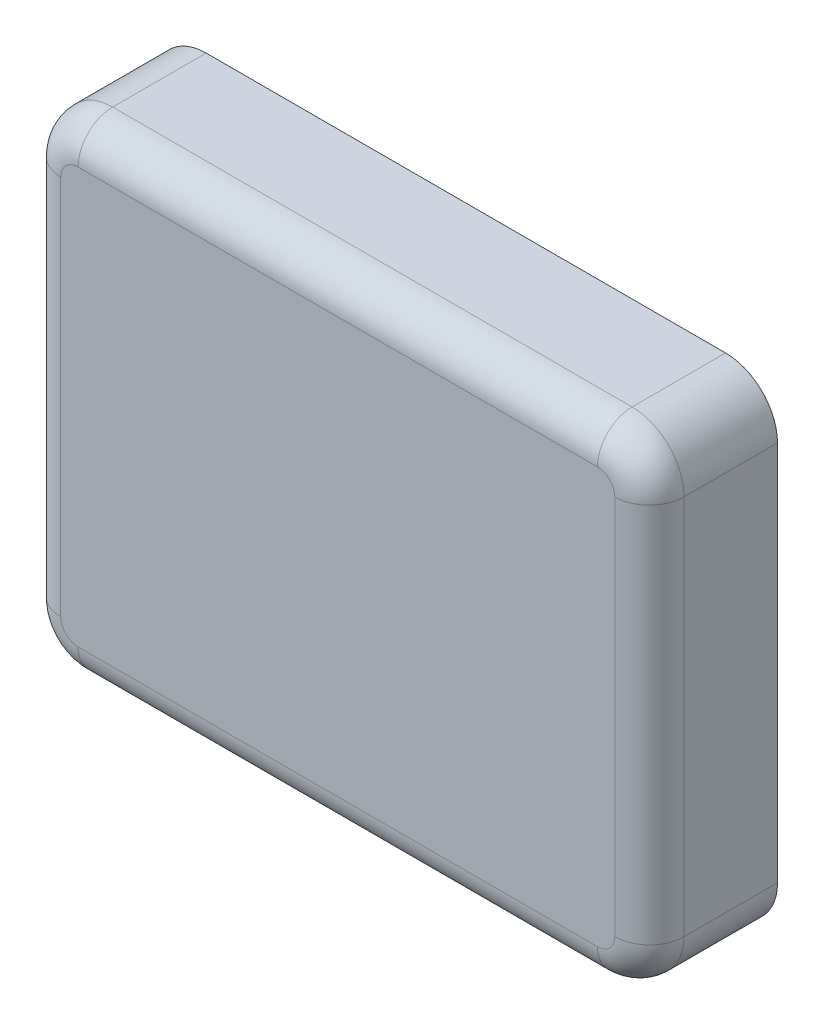
ISO-10303-21;
HEADER;
FILE_DESCRIPTION(('STEP AP214'),'2;1');
FILE_NAME('part.step','',(''),(''),'','','');
FILE_SCHEMA(('AUTOMOTIVE_DESIGN { 1 0 10303 214 1 1 1 1 }'));
ENDSEC;
DATA;
#1=APPLICATION_CONTEXT('core data for automotive mechanical design processes');
#2=APPLICATION_PROTOCOL_DEFINITION('international standard','automotive_design',2000,#1);
#3=PRODUCT_CONTEXT('',#1,'mechanical');
#4=PRODUCT('Part','Part','',(#3));
#5=PRODUCT_RELATED_PRODUCT_CATEGORY('part','',(#4));
#6=PRODUCT_DEFINITION_FORMATION('','',#4);
#7=PRODUCT_DEFINITION_CONTEXT('part definition',#1,'design');
#8=PRODUCT_DEFINITION('design','',#6,#7);
#9=PRODUCT_DEFINITION_SHAPE('','',#8);
#10=(LENGTH_UNIT() NAMED_UNIT(*) SI_UNIT(.MILLI.,.METRE.));
#11=(NAMED_UNIT(*) PLANE_ANGLE_UNIT() SI_UNIT($,.RADIAN.));
#12=(NAMED_UNIT(*) SI_UNIT($,.STERADIAN.) SOLID_ANGLE_UNIT());
#13=UNCERTAINTY_MEASURE_WITH_UNIT(LENGTH_MEASURE(1.E-05),#10,'distance_accuracy_value','');
#14=(GEOMETRIC_REPRESENTATION_CONTEXT(3) GLOBAL_UNCERTAINTY_ASSIGNED_CONTEXT((#13)) GLOBAL_UNIT_ASSIGNED_CONTEXT((#10,
#11,#12)) REPRESENTATION_CONTEXT('',''));
#15=CARTESIAN_POINT('',(0.,0.,0.));
#16=DIRECTION('',(0.,0.,1.));
#17=DIRECTION('',(1.,0.,0.));
#18=AXIS2_PLACEMENT_3D('',#15,#16,#17);
#19=CARTESIAN_POINT('',(-0.9,-0.7,0.33));
#20=DIRECTION('',(1.,0.,0.));
#21=DIRECTION('',(0.,0.,-1.));
#22=AXIS2_PLACEMENT_3D('',#19,#20,#21);
#23=PLANE('',#22);
#24=DIRECTION('',(0.,0.,1.));
#25=VECTOR('',#24,1.);
#26=CARTESIAN_POINT('',(-0.9,-0.55,0.33));
#27=LINE('',#26,#25);
#28=CARTESIAN_POINT('',(-0.9,-0.55,0.33));
#29=VERTEX_POINT('',#28);
#30=CARTESIAN_POINT('',(-0.9,-0.55,0.6));
#31=VERTEX_POINT('',#30);
#32=EDGE_CURVE('E10',#29,#31,#27,.T.);
#33=ORIENTED_EDGE('',*,*,#32,.T.);
#34=DIRECTION('',(0.,-1.,0.));
#35=VECTOR('',#34,1.);
#36=CARTESIAN_POINT('',(-0.9,0.55,0.6));
#37=LINE('',#36,#35);
#38=CARTESIAN_POINT('',(-0.9,0.55,0.6));
#39=VERTEX_POINT('',#38);
#40=EDGE_CURVE('E227',#39,#31,#37,.T.);
#41=ORIENTED_EDGE('',*,*,#40,.F.);
#42=DIRECTION('',(0.,0.,1.));
#43=VECTOR('',#42,1.);
#44=CARTESIAN_POINT('',(-0.9,0.55,0.33));
#45=LINE('',#44,#43);
#46=CARTESIAN_POINT('',(-0.9,0.55,0.33));
#47=VERTEX_POINT('',#46);
#48=EDGE_CURVE('E215',#47,#39,#45,.T.);
#49=ORIENTED_EDGE('',*,*,#48,.F.);
#50=DIRECTION('',(0.,1.,0.));
#51=VECTOR('',#50,1.);
#52=CARTESIAN_POINT('',(-0.9,-0.7,0.33));
#53=LINE('',#52,#51);
#54=EDGE_CURVE('E208',#29,#47,#53,.T.);
#55=ORIENTED_EDGE('',*,*,#54,.F.);
#56=EDGE_LOOP('',(#33,#41,#49,#55));
#57=FACE_BOUND('',#56,.T.);
#58=ADVANCED_FACE('F16',(#57),#23,.F.);
#59=CARTESIAN_POINT('',(-0.75,-0.55,0.33));
#60=DIRECTION('',(0.,0.,1.));
#61=DIRECTION('',(1.,0.,0.));
#62=AXIS2_PLACEMENT_3D('',#59,#60,#61);
#63=CYLINDRICAL_SURFACE('',#62,0.15);
#64=ORIENTED_EDGE('',*,*,#32,.F.);
#65=CARTESIAN_POINT('',(-0.75,-0.55,0.33));
#66=DIRECTION('',(0.,0.,1.));
#67=DIRECTION('',(1.,0.,0.));
#68=AXIS2_PLACEMENT_3D('',#65,#66,#67);
#69=CIRCLE('',#68,0.15);
#70=CARTESIAN_POINT('',(-0.75,-0.7,0.33));
#71=VERTEX_POINT('',#70);
#72=EDGE_CURVE('E26',#29,#71,#69,.T.);
#73=ORIENTED_EDGE('',*,*,#72,.T.);
#74=DIRECTION('',(0.,0.,1.));
#75=VECTOR('',#74,1.);
#76=CARTESIAN_POINT('',(-0.75,-0.7,0.33));
#77=LINE('',#76,#75);
#78=CARTESIAN_POINT('',(-0.75,-0.7,0.6));
#79=VERTEX_POINT('',#78);
#80=EDGE_CURVE('E232',#71,#79,#77,.T.);
#81=ORIENTED_EDGE('',*,*,#80,.T.);
#82=CARTESIAN_POINT('',(-0.75,-0.55,0.6));
#83=DIRECTION('',(0.,0.,1.));
#84=DIRECTION('',(1.,0.,0.));
#85=AXIS2_PLACEMENT_3D('',#82,#83,#84);
#86=CIRCLE('',#85,0.15);
#87=EDGE_CURVE('E35',#31,#79,#86,.T.);
#88=ORIENTED_EDGE('',*,*,#87,.F.);
#89=EDGE_LOOP('',(#64,#73,#81,#88));
#90=FACE_BOUND('',#89,.T.);
#91=ADVANCED_FACE('F251',(#90),#63,.T.);
#92=CARTESIAN_POINT('',(-0.8,0.55,0.6));
#93=DIRECTION('',(0.,-1.,0.));
#94=DIRECTION('',(0.,0.,-1.));
#95=AXIS2_PLACEMENT_3D('',#92,#93,#94);
#96=CYLINDRICAL_SURFACE('',#95,0.1);
#97=CARTESIAN_POINT('',(-0.8,0.55,0.6));
#98=DIRECTION('',(0.,-1.,0.));
#99=DIRECTION('',(-1.,0.,0.));
#100=AXIS2_PLACEMENT_3D('',#97,#98,#99);
#101=CIRCLE('',#100,0.1);
#102=CARTESIAN_POINT('',(-0.8,0.55,0.7));
#103=VERTEX_POINT('',#102);
#104=EDGE_CURVE('E234',#103,#39,#101,.T.);
#105=ORIENTED_EDGE('',*,*,#104,.T.);
#106=ORIENTED_EDGE('',*,*,#40,.T.);
#107=CARTESIAN_POINT('',(-0.8,-0.55,0.6));
#108=DIRECTION('',(0.,-1.,0.));
#109=DIRECTION('',(0.,0.,-1.));
#110=AXIS2_PLACEMENT_3D('',#107,#108,#109);
#111=CIRCLE('',#110,0.1);
#112=CARTESIAN_POINT('',(-0.8,-0.55,0.7));
#113=VERTEX_POINT('',#112);
#114=EDGE_CURVE('E203',#113,#31,#111,.T.);
#115=ORIENTED_EDGE('',*,*,#114,.F.);
#116=DIRECTION('',(0.,-1.,0.));
#117=VECTOR('',#116,1.);
#118=CARTESIAN_POINT('',(-0.8,0.55,0.7));
#119=LINE('',#118,#117);
#120=EDGE_CURVE('E185',#103,#113,#119,.T.);
#121=ORIENTED_EDGE('',*,*,#120,.F.);
#122=EDGE_LOOP('',(#105,#106,#115,#121));
#123=FACE_BOUND('',#122,.T.);
#124=ADVANCED_FACE('F237',(#123),#96,.T.);
#125=CARTESIAN_POINT('',(-0.9,-0.7,0.33));
#126=DIRECTION('',(0.,0.,1.));
#127=DIRECTION('',(1.,0.,0.));
#128=AXIS2_PLACEMENT_3D('',#125,#126,#127);
#129=PLANE('',#128);
#130=ORIENTED_EDGE('',*,*,#54,.T.);
#131=CARTESIAN_POINT('',(-0.75,0.55,0.33));
#132=DIRECTION('',(0.,0.,-1.));
#133=DIRECTION('',(0.,-1.,0.));
#134=AXIS2_PLACEMENT_3D('',#131,#132,#133);
#135=CIRCLE('',#134,0.15);
#136=CARTESIAN_POINT('',(-0.75,0.7,0.33));
#137=VERTEX_POINT('',#136);
#138=EDGE_CURVE('E205',#47,#137,#135,.T.);
#139=ORIENTED_EDGE('',*,*,#138,.T.);
#140=DIRECTION('',(1.,0.,0.));
#141=VECTOR('',#140,1.);
#142=CARTESIAN_POINT('',(-0.9,0.7,0.33));
#143=LINE('',#142,#141);
#144=CARTESIAN_POINT('',(0.75,0.7,0.33));
#145=VERTEX_POINT('',#144);
#146=EDGE_CURVE('E209',#137,#145,#143,.T.);
#147=ORIENTED_EDGE('',*,*,#146,.T.);
#148=CARTESIAN_POINT('',(0.75,0.55,0.33));
#149=DIRECTION('',(0.,0.,1.));
#150=DIRECTION('',(1.,0.,0.));
#151=AXIS2_PLACEMENT_3D('',#148,#149,#150);
#152=CIRCLE('',#151,0.15);
#153=CARTESIAN_POINT('',(0.9,0.55,0.33));
#154=VERTEX_POINT('',#153);
#155=EDGE_CURVE('E158',#154,#145,#152,.T.);
#156=ORIENTED_EDGE('',*,*,#155,.F.);
#157=DIRECTION('',(0.,1.,0.));
#158=VECTOR('',#157,1.);
#159=CARTESIAN_POINT('',(0.9,-0.7,0.33));
#160=LINE('',#159,#158);
#161=CARTESIAN_POINT('',(0.9,-0.55,0.33));
#162=VERTEX_POINT('',#161);
#163=EDGE_CURVE('E128',#162,#154,#160,.T.);
#164=ORIENTED_EDGE('',*,*,#163,.F.);
#165=CARTESIAN_POINT('',(0.75,-0.55,0.33));
#166=DIRECTION('',(0.,0.,-1.));
#167=DIRECTION('',(0.,-1.,0.));
#168=AXIS2_PLACEMENT_3D('',#165,#166,#167);
#169=CIRCLE('',#168,0.15);
#170=CARTESIAN_POINT('',(0.75,-0.7,0.33));
#171=VERTEX_POINT('',#170);
#172=EDGE_CURVE('E212',#162,#171,#169,.T.);
#173=ORIENTED_EDGE('',*,*,#172,.T.);
#174=DIRECTION('',(1.,0.,0.));
#175=VECTOR('',#174,1.);
#176=CARTESIAN_POINT('',(-0.9,-0.7,0.33));
#177=LINE('',#176,#175);
#178=EDGE_CURVE('E195',#71,#171,#177,.T.);
#179=ORIENTED_EDGE('',*,*,#178,.F.);
#180=ORIENTED_EDGE('',*,*,#72,.F.);
#181=EDGE_LOOP('',(#130,#139,#147,#156,#164,#173,#179,#180));
#182=FACE_BOUND('',#181,.T.);
#183=ADVANCED_FACE('F250',(#182),#129,.F.);
#184=CARTESIAN_POINT('',(-0.75,0.55,0.33));
#185=DIRECTION('',(0.,0.,1.));
#186=DIRECTION('',(1.,0.,0.));
#187=AXIS2_PLACEMENT_3D('',#184,#185,#186);
#188=CYLINDRICAL_SURFACE('',#187,0.15);
#189=ORIENTED_EDGE('',*,*,#48,.T.);
#190=CARTESIAN_POINT('',(-0.75,0.55,0.6));
#191=DIRECTION('',(0.,0.,1.));
#192=DIRECTION('',(1.,0.,0.));
#193=AXIS2_PLACEMENT_3D('',#190,#191,#192);
#194=CIRCLE('',#193,0.15);
#195=CARTESIAN_POINT('',(-0.75,0.7,0.6));
#196=VERTEX_POINT('',#195);
#197=EDGE_CURVE('E183',#196,#39,#194,.T.);
#198=ORIENTED_EDGE('',*,*,#197,.F.);
#199=DIRECTION('',(0.,0.,1.));
#200=VECTOR('',#199,1.);
#201=CARTESIAN_POINT('',(-0.75,0.7,0.33));
#202=LINE('',#201,#200);
#203=EDGE_CURVE('E162',#137,#196,#202,.T.);
#204=ORIENTED_EDGE('',*,*,#203,.F.);
#205=ORIENTED_EDGE('',*,*,#138,.F.);
#206=EDGE_LOOP('',(#189,#198,#204,#205));
#207=FACE_BOUND('',#206,.T.);
#208=ADVANCED_FACE('F265',(#207),#188,.T.);
#209=CARTESIAN_POINT('',(-0.8,-0.55,0.7));
#210=CARTESIAN_POINT('',(-0.8,-0.6,0.7));
#211=CARTESIAN_POINT('',(-0.75,-0.6,0.7));
#212=CARTESIAN_POINT('',(-0.7,-0.6,0.7));
#213=CARTESIAN_POINT('',(-0.7,-0.55,0.7));
#214=CARTESIAN_POINT('',(-0.7,-0.5,0.7));
#215=CARTESIAN_POINT('',(-0.75,-0.5,0.7));
#216=CARTESIAN_POINT('',(-0.8,-0.5,0.7));
#217=CARTESIAN_POINT('',(-0.8,-0.55,0.7));
#218=CARTESIAN_POINT('',(-0.82617993878,-0.55,0.7));
#219=CARTESIAN_POINT('',(-0.82617993878,-0.62617993878,0.7));
#220=CARTESIAN_POINT('',(-0.75,-0.62617993878,0.7));
#221=CARTESIAN_POINT('',(-0.67382006122,-0.62617993878,0.7));
#222=CARTESIAN_POINT('',(-0.67382006122,-0.55,0.7));
#223=CARTESIAN_POINT('',(-0.67382006122,-0.47382006122,0.7));
#224=CARTESIAN_POINT('',(-0.75,-0.47382006122,0.7));
#225=CARTESIAN_POINT('',(-0.82617993878,-0.47382006122,0.7));
#226=CARTESIAN_POINT('',(-0.82617993878,-0.55,0.7));
#227=CARTESIAN_POINT('',(-0.852357650071,-0.55,0.691777231398));
#228=CARTESIAN_POINT('',(-0.852357650071,-0.652357650071,0.691777231398));
#229=CARTESIAN_POINT('',(-0.75,-0.652357650071,0.691777231398));
#230=CARTESIAN_POINT('',(-0.647642349929,-0.652357650071,0.691777231398));
#231=CARTESIAN_POINT('',(-0.647642349929,-0.55,0.691777231398));
#232=CARTESIAN_POINT('',(-0.647642349929,-0.447642349929,0.691777231398));
#233=CARTESIAN_POINT('',(-0.75,-0.447642349929,0.691777231398));
#234=CARTESIAN_POINT('',(-0.852357650071,-0.447642349929,0.691777231398));
#235=CARTESIAN_POINT('',(-0.852357650071,-0.55,0.691777231398));
#236=CARTESIAN_POINT('',(-0.875319014964,-0.55,0.675319014964));
#237=CARTESIAN_POINT('',(-0.875319014964,-0.675319014964,0.675319014964));
#238=CARTESIAN_POINT('',(-0.75,-0.675319014964,0.675319014964));
#239=CARTESIAN_POINT('',(-0.624680985036,-0.675319014964,0.675319014964));
#240=CARTESIAN_POINT('',(-0.624680985036,-0.55,0.675319014964));
#241=CARTESIAN_POINT('',(-0.624680985036,-0.424680985036,0.675319014964));
#242=CARTESIAN_POINT('',(-0.75,-0.424680985036,0.675319014964));
#243=CARTESIAN_POINT('',(-0.875319014964,-0.424680985036,0.675319014964));
#244=CARTESIAN_POINT('',(-0.875319014964,-0.55,0.675319014964));
#245=CARTESIAN_POINT('',(-0.891777231398,-0.55,0.652357650071));
#246=CARTESIAN_POINT('',(-0.891777231398,-0.691777231398,0.652357650071));
#247=CARTESIAN_POINT('',(-0.75,-0.691777231398,0.652357650071));
#248=CARTESIAN_POINT('',(-0.608222768602,-0.691777231398,0.652357650071));
#249=CARTESIAN_POINT('',(-0.608222768602,-0.55,0.652357650071));
#250=CARTESIAN_POINT('',(-0.608222768602,-0.408222768602,0.652357650071));
#251=CARTESIAN_POINT('',(-0.75,-0.408222768602,0.652357650071));
#252=CARTESIAN_POINT('',(-0.891777231398,-0.408222768602,0.652357650071));
#253=CARTESIAN_POINT('',(-0.891777231398,-0.55,0.652357650071));
#254=CARTESIAN_POINT('',(-0.9,-0.55,0.62617993878));
#255=CARTESIAN_POINT('',(-0.9,-0.7,0.62617993878));
#256=CARTESIAN_POINT('',(-0.75,-0.7,0.62617993878));
#257=CARTESIAN_POINT('',(-0.6,-0.7,0.62617993878));
#258=CARTESIAN_POINT('',(-0.6,-0.55,0.62617993878));
#259=CARTESIAN_POINT('',(-0.6,-0.4,0.62617993878));
#260=CARTESIAN_POINT('',(-0.75,-0.4,0.62617993878));
#261=CARTESIAN_POINT('',(-0.9,-0.4,0.62617993878));
#262=CARTESIAN_POINT('',(-0.9,-0.55,0.62617993878));
#263=CARTESIAN_POINT('',(-0.9,-0.55,0.6));
#264=CARTESIAN_POINT('',(-0.9,-0.7,0.6));
#265=CARTESIAN_POINT('',(-0.75,-0.7,0.6));
#266=CARTESIAN_POINT('',(-0.6,-0.7,0.6));
#267=CARTESIAN_POINT('',(-0.6,-0.55,0.6));
#268=CARTESIAN_POINT('',(-0.6,-0.4,0.6));
#269=CARTESIAN_POINT('',(-0.75,-0.4,0.6));
#270=CARTESIAN_POINT('',(-0.9,-0.4,0.6));
#271=CARTESIAN_POINT('',(-0.9,-0.55,0.6));
#272=(BOUNDED_SURFACE() B_SPLINE_SURFACE(6,2,((#209,#210,#211,#212,#213,#214,#215,#216,#217),
(#218,#219,#220,#221,#222,#223,#224,#225,#226),(#227,#228,#229,#230,#231,#232,#233,#234,#235),
(#236,#237,#238,#239,#240,#241,#242,#243,#244),(#245,#246,#247,#248,#249,#250,#251,#252,#253),
(#254,#255,#256,#257,#258,#259,#260,#261,#262),(#263,#264,#265,#266,#267,#268,#269,#270,#271)),
.UNSPECIFIED.,.F.,.T.,.F.) B_SPLINE_SURFACE_WITH_KNOTS((7,7),(3,2,2,2,3),(4.712388980385,
6.28318530718),(0.,1.5707963267949,3.14159265358979,4.71238898038469,6.28318530717959),
.UNSPECIFIED.) GEOMETRIC_REPRESENTATION_ITEM() RATIONAL_B_SPLINE_SURFACE(((1.,0.707106781186548,
1.,0.707106781186548,1.,0.707106781186548,1.,0.707106781186548,1.),(1.,0.707106781186548,1.,
0.707106781186548,1.,0.707106781186548,1.,0.707106781186548,1.),(1.,0.707106781186548,1.,
0.707106781186548,1.,0.707106781186548,1.,0.707106781186548,1.),(1.,0.707106781186548,1.,
0.707106781186548,1.,0.707106781186548,1.,0.707106781186548,1.),(1.,0.707106781186548,1.,
0.707106781186548,1.,0.707106781186548,1.,0.707106781186548,1.),(1.,0.707106781186548,1.,
0.707106781186548,1.,0.707106781186548,1.,0.707106781186548,1.),(1.,0.707106781186548,1.,
0.707106781186548,1.,0.707106781186548,1.,0.707106781186548,1.))) REPRESENTATION_ITEM('') SURFACE());
#273=CARTESIAN_POINT('',(-0.75,-0.6,0.6));
#274=DIRECTION('',(1.,0.,0.));
#275=DIRECTION('',(0.,1.,0.));
#276=AXIS2_PLACEMENT_3D('',#273,#274,#275);
#277=CIRCLE('',#276,0.1);
#278=CARTESIAN_POINT('',(-0.75,-0.6,0.7));
#279=VERTEX_POINT('',#278);
#280=EDGE_CURVE('E130',#279,#79,#277,.T.);
#281=CARTESIAN_POINT('',(-0.75,-0.55,0.7));
#282=DIRECTION('',(0.,0.,1.));
#283=DIRECTION('',(1.,0.,0.));
#284=AXIS2_PLACEMENT_3D('',#281,#282,#283);
#285=CIRCLE('',#284,0.05);
#286=EDGE_CURVE('E197',#113,#279,#285,.T.);
#287=ORIENTED_EDGE('',*,*,#114,.T.);
#288=ORIENTED_EDGE('',*,*,#87,.T.);
#289=ORIENTED_EDGE('',*,*,#280,.F.);
#290=ORIENTED_EDGE('',*,*,#286,.F.);
#291=EDGE_LOOP('',(#287,#288,#289,#290));
#292=FACE_BOUND('',#291,.T.);
#293=ADVANCED_FACE('F242',(#292),#272,.T.);
#294=CARTESIAN_POINT('',(-0.9,-0.7,0.33));
#295=DIRECTION('',(0.,1.,0.));
#296=DIRECTION('',(0.,0.,1.));
#297=AXIS2_PLACEMENT_3D('',#294,#295,#296);
#298=PLANE('',#297);
#299=ORIENTED_EDGE('',*,*,#80,.F.);
#300=ORIENTED_EDGE('',*,*,#178,.T.);
#301=DIRECTION('',(0.,0.,1.));
#302=VECTOR('',#301,1.);
#303=CARTESIAN_POINT('',(0.75,-0.7,0.33));
#304=LINE('',#303,#302);
#305=CARTESIAN_POINT('',(0.75,-0.7,0.6));
#306=VERTEX_POINT('',#305);
#307=EDGE_CURVE('E178',#171,#306,#304,.T.);
#308=ORIENTED_EDGE('',*,*,#307,.T.);
#309=DIRECTION('',(1.,0.,0.));
#310=VECTOR('',#309,1.);
#311=CARTESIAN_POINT('',(-0.75,-0.7,0.6));
#312=LINE('',#311,#310);
#313=EDGE_CURVE('E167',#79,#306,#312,.T.);
#314=ORIENTED_EDGE('',*,*,#313,.F.);
#315=EDGE_LOOP('',(#299,#300,#308,#314));
#316=FACE_BOUND('',#315,.T.);
#317=ADVANCED_FACE('F249',(#316),#298,.F.);
#318=CARTESIAN_POINT('',(-0.75,0.6,0.7));
#319=CARTESIAN_POINT('',(-0.8,0.6,0.7));
#320=CARTESIAN_POINT('',(-0.8,0.55,0.7));
#321=CARTESIAN_POINT('',(-0.8,0.5,0.7));
#322=CARTESIAN_POINT('',(-0.75,0.5,0.7));
#323=CARTESIAN_POINT('',(-0.7,0.5,0.7));
#324=CARTESIAN_POINT('',(-0.7,0.55,0.7));
#325=CARTESIAN_POINT('',(-0.7,0.6,0.7));
#326=CARTESIAN_POINT('',(-0.75,0.6,0.7));
#327=CARTESIAN_POINT('',(-0.75,0.62617993878,0.7));
#328=CARTESIAN_POINT('',(-0.82617993878,0.62617993878,0.7));
#329=CARTESIAN_POINT('',(-0.82617993878,0.55,0.7));
#330=CARTESIAN_POINT('',(-0.82617993878,0.47382006122,0.7));
#331=CARTESIAN_POINT('',(-0.75,0.47382006122,0.7));
#332=CARTESIAN_POINT('',(-0.67382006122,0.47382006122,0.7));
#333=CARTESIAN_POINT('',(-0.67382006122,0.55,0.7));
#334=CARTESIAN_POINT('',(-0.67382006122,0.62617993878,0.7));
#335=CARTESIAN_POINT('',(-0.75,0.62617993878,0.7));
#336=CARTESIAN_POINT('',(-0.75,0.652357650071,0.691777231398));
#337=CARTESIAN_POINT('',(-0.852357650071,0.652357650071,0.691777231398));
#338=CARTESIAN_POINT('',(-0.852357650071,0.55,0.691777231398));
#339=CARTESIAN_POINT('',(-0.852357650071,0.447642349929,0.691777231398));
#340=CARTESIAN_POINT('',(-0.75,0.447642349929,0.691777231398));
#341=CARTESIAN_POINT('',(-0.647642349929,0.447642349929,0.691777231398));
#342=CARTESIAN_POINT('',(-0.647642349929,0.55,0.691777231398));
#343=CARTESIAN_POINT('',(-0.647642349929,0.652357650071,0.691777231398));
#344=CARTESIAN_POINT('',(-0.75,0.652357650071,0.691777231398));
#345=CARTESIAN_POINT('',(-0.75,0.675319014964,0.675319014964));
#346=CARTESIAN_POINT('',(-0.875319014964,0.675319014964,0.675319014964));
#347=CARTESIAN_POINT('',(-0.875319014964,0.55,0.675319014964));
#348=CARTESIAN_POINT('',(-0.875319014964,0.424680985036,0.675319014964));
#349=CARTESIAN_POINT('',(-0.75,0.424680985036,0.675319014964));
#350=CARTESIAN_POINT('',(-0.624680985036,0.424680985036,0.675319014964));
#351=CARTESIAN_POINT('',(-0.624680985036,0.55,0.675319014964));
#352=CARTESIAN_POINT('',(-0.624680985036,0.675319014964,0.675319014964));
#353=CARTESIAN_POINT('',(-0.75,0.675319014964,0.675319014964));
#354=CARTESIAN_POINT('',(-0.75,0.691777231398,0.652357650071));
#355=CARTESIAN_POINT('',(-0.891777231398,0.691777231398,0.652357650071));
#356=CARTESIAN_POINT('',(-0.891777231398,0.55,0.652357650071));
#357=CARTESIAN_POINT('',(-0.891777231398,0.408222768602,0.652357650071));
#358=CARTESIAN_POINT('',(-0.75,0.408222768602,0.652357650071));
#359=CARTESIAN_POINT('',(-0.608222768602,0.408222768602,0.652357650071));
#360=CARTESIAN_POINT('',(-0.608222768602,0.55,0.652357650071));
#361=CARTESIAN_POINT('',(-0.608222768602,0.691777231398,0.652357650071));
#362=CARTESIAN_POINT('',(-0.75,0.691777231398,0.652357650071));
#363=CARTESIAN_POINT('',(-0.75,0.7,0.62617993878));
#364=CARTESIAN_POINT('',(-0.9,0.7,0.62617993878));
#365=CARTESIAN_POINT('',(-0.9,0.55,0.62617993878));
#366=CARTESIAN_POINT('',(-0.9,0.4,0.62617993878));
#367=CARTESIAN_POINT('',(-0.75,0.4,0.62617993878));
#368=CARTESIAN_POINT('',(-0.6,0.4,0.62617993878));
#369=CARTESIAN_POINT('',(-0.6,0.55,0.62617993878));
#370=CARTESIAN_POINT('',(-0.6,0.7,0.62617993878));
#371=CARTESIAN_POINT('',(-0.75,0.7,0.62617993878));
#372=CARTESIAN_POINT('',(-0.75,0.7,0.6));
#373=CARTESIAN_POINT('',(-0.9,0.7,0.6));
#374=CARTESIAN_POINT('',(-0.9,0.55,0.6));
#375=CARTESIAN_POINT('',(-0.9,0.4,0.6));
#376=CARTESIAN_POINT('',(-0.75,0.4,0.6));
#377=CARTESIAN_POINT('',(-0.6,0.4,0.6));
#378=CARTESIAN_POINT('',(-0.6,0.55,0.6));
#379=CARTESIAN_POINT('',(-0.6,0.7,0.6));
#380=CARTESIAN_POINT('',(-0.75,0.7,0.6));
#381=(BOUNDED_SURFACE() B_SPLINE_SURFACE(6,2,((#318,#319,#320,#321,#322,#323,#324,#325,#326),
(#327,#328,#329,#330,#331,#332,#333,#334,#335),(#336,#337,#338,#339,#340,#341,#342,#343,#344),
(#345,#346,#347,#348,#349,#350,#351,#352,#353),(#354,#355,#356,#357,#358,#359,#360,#361,#362),
(#363,#364,#365,#366,#367,#368,#369,#370,#371),(#372,#373,#374,#375,#376,#377,#378,#379,#380)),
.UNSPECIFIED.,.F.,.T.,.F.) B_SPLINE_SURFACE_WITH_KNOTS((7,7),(3,2,2,2,3),(4.712388980385,
6.28318530718),(0.,1.5707963267949,3.14159265358979,4.71238898038469,6.28318530717959),
.UNSPECIFIED.) GEOMETRIC_REPRESENTATION_ITEM() RATIONAL_B_SPLINE_SURFACE(((1.,0.707106781186548,
1.,0.707106781186548,1.,0.707106781186548,1.,0.707106781186548,1.),(1.,0.707106781186548,1.,
0.707106781186548,1.,0.707106781186548,1.,0.707106781186548,1.),(1.,0.707106781186548,1.,
0.707106781186548,1.,0.707106781186548,1.,0.707106781186548,1.),(1.,0.707106781186548,1.,
0.707106781186548,1.,0.707106781186548,1.,0.707106781186548,1.),(1.,0.707106781186548,1.,
0.707106781186548,1.,0.707106781186548,1.,0.707106781186548,1.),(1.,0.707106781186548,1.,
0.707106781186548,1.,0.707106781186548,1.,0.707106781186548,1.),(1.,0.707106781186548,1.,
0.707106781186548,1.,0.707106781186548,1.,0.707106781186548,1.))) REPRESENTATION_ITEM('') SURFACE());
#382=CARTESIAN_POINT('',(-0.75,0.6,0.6));
#383=DIRECTION('',(-1.,0.,0.));
#384=DIRECTION('',(0.,0.,1.));
#385=AXIS2_PLACEMENT_3D('',#382,#383,#384);
#386=CIRCLE('',#385,0.1);
#387=CARTESIAN_POINT('',(-0.75,0.6,0.7));
#388=VERTEX_POINT('',#387);
#389=EDGE_CURVE('E180',#388,#196,#386,.T.);
#390=CARTESIAN_POINT('',(-0.75,0.55,0.7));
#391=DIRECTION('',(0.,0.,1.));
#392=DIRECTION('',(1.,0.,0.));
#393=AXIS2_PLACEMENT_3D('',#390,#391,#392);
#394=CIRCLE('',#393,0.05);
#395=EDGE_CURVE('E152',#388,#103,#394,.T.);
#396=ORIENTED_EDGE('',*,*,#389,.T.);
#397=ORIENTED_EDGE('',*,*,#197,.T.);
#398=ORIENTED_EDGE('',*,*,#104,.F.);
#399=ORIENTED_EDGE('',*,*,#395,.F.);
#400=EDGE_LOOP('',(#396,#397,#398,#399));
#401=FACE_BOUND('',#400,.T.);
#402=ADVANCED_FACE('F354',(#401),#381,.T.);
#403=CARTESIAN_POINT('',(-0.9,-0.7,0.7));
#404=DIRECTION('',(0.,0.,1.));
#405=DIRECTION('',(1.,0.,0.));
#406=AXIS2_PLACEMENT_3D('',#403,#404,#405);
#407=PLANE('',#406);
#408=DIRECTION('',(1.,0.,0.));
#409=VECTOR('',#408,1.);
#410=CARTESIAN_POINT('',(-0.75,-0.6,0.7));
#411=LINE('',#410,#409);
#412=CARTESIAN_POINT('',(0.75,-0.6,0.7));
#413=VERTEX_POINT('',#412);
#414=EDGE_CURVE('E147',#279,#413,#411,.T.);
#415=ORIENTED_EDGE('',*,*,#414,.T.);
#416=CARTESIAN_POINT('',(0.75,-0.55,0.7));
#417=DIRECTION('',(0.,0.,1.));
#418=DIRECTION('',(1.,0.,0.));
#419=AXIS2_PLACEMENT_3D('',#416,#417,#418);
#420=CIRCLE('',#419,0.05);
#421=CARTESIAN_POINT('',(0.8,-0.55,0.7));
#422=VERTEX_POINT('',#421);
#423=EDGE_CURVE('E145',#413,#422,#420,.T.);
#424=ORIENTED_EDGE('',*,*,#423,.T.);
#425=DIRECTION('',(0.,1.,0.));
#426=VECTOR('',#425,1.);
#427=CARTESIAN_POINT('',(0.8,-0.55,0.7));
#428=LINE('',#427,#426);
#429=CARTESIAN_POINT('',(0.8,0.55,0.7));
#430=VERTEX_POINT('',#429);
#431=EDGE_CURVE('E139',#422,#430,#428,.T.);
#432=ORIENTED_EDGE('',*,*,#431,.T.);
#433=CARTESIAN_POINT('',(0.75,0.55,0.7));
#434=DIRECTION('',(0.,0.,1.));
#435=DIRECTION('',(1.,0.,0.));
#436=AXIS2_PLACEMENT_3D('',#433,#434,#435);
#437=CIRCLE('',#436,0.05);
#438=CARTESIAN_POINT('',(0.75,0.6,0.7));
#439=VERTEX_POINT('',#438);
#440=EDGE_CURVE('E134',#430,#439,#437,.T.);
#441=ORIENTED_EDGE('',*,*,#440,.T.);
#442=DIRECTION('',(-1.,0.,0.));
#443=VECTOR('',#442,1.);
#444=CARTESIAN_POINT('',(0.75,0.6,0.7));
#445=LINE('',#444,#443);
#446=EDGE_CURVE('E140',#439,#388,#445,.T.);
#447=ORIENTED_EDGE('',*,*,#446,.T.);
#448=ORIENTED_EDGE('',*,*,#395,.T.);
#449=ORIENTED_EDGE('',*,*,#120,.T.);
#450=ORIENTED_EDGE('',*,*,#286,.T.);
#451=EDGE_LOOP('',(#415,#424,#432,#441,#447,#448,#449,#450));
#452=FACE_BOUND('',#451,.T.);
#453=ADVANCED_FACE('F144',(#452),#407,.T.);
#454=CARTESIAN_POINT('',(-0.9,0.7,0.33));
#455=DIRECTION('',(0.,1.,0.));
#456=DIRECTION('',(0.,0.,1.));
#457=AXIS2_PLACEMENT_3D('',#454,#455,#456);
#458=PLANE('',#457);
#459=ORIENTED_EDGE('',*,*,#203,.T.);
#460=DIRECTION('',(-1.,0.,0.));
#461=VECTOR('',#460,1.);
#462=CARTESIAN_POINT('',(0.75,0.7,0.6));
#463=LINE('',#462,#461);
#464=CARTESIAN_POINT('',(0.75,0.7,0.6));
#465=VERTEX_POINT('',#464);
#466=EDGE_CURVE('E153',#465,#196,#463,.T.);
#467=ORIENTED_EDGE('',*,*,#466,.F.);
#468=DIRECTION('',(0.,0.,1.));
#469=VECTOR('',#468,1.);
#470=CARTESIAN_POINT('',(0.75,0.7,0.33));
#471=LINE('',#470,#469);
#472=EDGE_CURVE('E114',#145,#465,#471,.T.);
#473=ORIENTED_EDGE('',*,*,#472,.F.);
#474=ORIENTED_EDGE('',*,*,#146,.F.);
#475=EDGE_LOOP('',(#459,#467,#473,#474));
#476=FACE_BOUND('',#475,.T.);
#477=ADVANCED_FACE('F270',(#476),#458,.T.);
#478=CARTESIAN_POINT('',(0.75,-0.55,0.33));
#479=DIRECTION('',(0.,0.,1.));
#480=DIRECTION('',(1.,0.,0.));
#481=AXIS2_PLACEMENT_3D('',#478,#479,#480);
#482=CYLINDRICAL_SURFACE('',#481,0.15);
#483=DIRECTION('',(0.,0.,1.));
#484=VECTOR('',#483,1.);
#485=CARTESIAN_POINT('',(0.9,-0.55,0.33));
#486=LINE('',#485,#484);
#487=CARTESIAN_POINT('',(0.9,-0.55,0.6));
#488=VERTEX_POINT('',#487);
#489=EDGE_CURVE('E159',#162,#488,#486,.T.);
#490=ORIENTED_EDGE('',*,*,#489,.T.);
#491=CARTESIAN_POINT('',(0.75,-0.55,0.6));
#492=DIRECTION('',(0.,0.,1.));
#493=DIRECTION('',(1.,0.,0.));
#494=AXIS2_PLACEMENT_3D('',#491,#492,#493);
#495=CIRCLE('',#494,0.15);
#496=EDGE_CURVE('E163',#306,#488,#495,.T.);
#497=ORIENTED_EDGE('',*,*,#496,.F.);
#498=ORIENTED_EDGE('',*,*,#307,.F.);
#499=ORIENTED_EDGE('',*,*,#172,.F.);
#500=EDGE_LOOP('',(#490,#497,#498,#499));
#501=FACE_BOUND('',#500,.T.);
#502=ADVANCED_FACE('F247',(#501),#482,.T.);
#503=CARTESIAN_POINT('',(0.75,0.55,0.33));
#504=DIRECTION('',(0.,0.,1.));
#505=DIRECTION('',(1.,0.,0.));
#506=AXIS2_PLACEMENT_3D('',#503,#504,#505);
#507=CYLINDRICAL_SURFACE('',#506,0.15);
#508=DIRECTION('',(0.,0.,1.));
#509=VECTOR('',#508,1.);
#510=CARTESIAN_POINT('',(0.9,0.55,0.33));
#511=LINE('',#510,#509);
#512=CARTESIAN_POINT('',(0.9,0.55,0.6));
#513=VERTEX_POINT('',#512);
#514=EDGE_CURVE('E112',#154,#513,#511,.T.);
#515=ORIENTED_EDGE('',*,*,#514,.F.);
#516=ORIENTED_EDGE('',*,*,#155,.T.);
#517=ORIENTED_EDGE('',*,*,#472,.T.);
#518=CARTESIAN_POINT('',(0.75,0.55,0.6));
#519=DIRECTION('',(0.,0.,1.));
#520=DIRECTION('',(1.,0.,0.));
#521=AXIS2_PLACEMENT_3D('',#518,#519,#520);
#522=CIRCLE('',#521,0.15);
#523=EDGE_CURVE('E110',#513,#465,#522,.T.);
#524=ORIENTED_EDGE('',*,*,#523,.F.);
#525=EDGE_LOOP('',(#515,#516,#517,#524));
#526=FACE_BOUND('',#525,.T.);
#527=ADVANCED_FACE('F111',(#526),#507,.T.);
#528=CARTESIAN_POINT('',(0.9,-0.7,0.33));
#529=DIRECTION('',(1.,0.,0.));
#530=DIRECTION('',(0.,0.,-1.));
#531=AXIS2_PLACEMENT_3D('',#528,#529,#530);
#532=PLANE('',#531);
#533=ORIENTED_EDGE('',*,*,#489,.F.);
#534=ORIENTED_EDGE('',*,*,#163,.T.);
#535=ORIENTED_EDGE('',*,*,#514,.T.);
#536=DIRECTION('',(0.,1.,0.));
#537=VECTOR('',#536,1.);
#538=CARTESIAN_POINT('',(0.9,-0.55,0.6));
#539=LINE('',#538,#537);
#540=EDGE_CURVE('E104',#488,#513,#539,.T.);
#541=ORIENTED_EDGE('',*,*,#540,.F.);
#542=EDGE_LOOP('',(#533,#534,#535,#541));
#543=FACE_BOUND('',#542,.T.);
#544=ADVANCED_FACE('F127',(#543),#532,.T.);
#545=CARTESIAN_POINT('',(-0.75,-0.6,0.6));
#546=DIRECTION('',(1.,0.,0.));
#547=DIRECTION('',(0.,1.,0.));
#548=AXIS2_PLACEMENT_3D('',#545,#546,#547);
#549=CYLINDRICAL_SURFACE('',#548,0.1);
#550=ORIENTED_EDGE('',*,*,#280,.T.);
#551=ORIENTED_EDGE('',*,*,#313,.T.);
#552=CARTESIAN_POINT('',(0.75,-0.6,0.6));
#553=DIRECTION('',(1.,0.,0.));
#554=DIRECTION('',(0.,1.,0.));
#555=AXIS2_PLACEMENT_3D('',#552,#553,#554);
#556=CIRCLE('',#555,0.1);
#557=EDGE_CURVE('E156',#413,#306,#556,.T.);
#558=ORIENTED_EDGE('',*,*,#557,.F.);
#559=ORIENTED_EDGE('',*,*,#414,.F.);
#560=EDGE_LOOP('',(#550,#551,#558,#559));
#561=FACE_BOUND('',#560,.T.);
#562=ADVANCED_FACE('F243',(#561),#549,.T.);
#563=CARTESIAN_POINT('',(0.75,0.6,0.6));
#564=DIRECTION('',(-1.,0.,0.));
#565=DIRECTION('',(0.,0.,1.));
#566=AXIS2_PLACEMENT_3D('',#563,#564,#565);
#567=CYLINDRICAL_SURFACE('',#566,0.1);
#568=CARTESIAN_POINT('',(0.75,0.6,0.6));
#569=DIRECTION('',(-1.,0.,0.));
#570=DIRECTION('',(0.,0.,1.));
#571=AXIS2_PLACEMENT_3D('',#568,#569,#570);
#572=CIRCLE('',#571,0.1);
#573=EDGE_CURVE('E136',#439,#465,#572,.T.);
#574=ORIENTED_EDGE('',*,*,#573,.T.);
#575=ORIENTED_EDGE('',*,*,#466,.T.);
#576=ORIENTED_EDGE('',*,*,#389,.F.);
#577=ORIENTED_EDGE('',*,*,#446,.F.);
#578=EDGE_LOOP('',(#574,#575,#576,#577));
#579=FACE_BOUND('',#578,.T.);
#580=ADVANCED_FACE('F271',(#579),#567,.T.);
#581=CARTESIAN_POINT('',(0.75,-0.6,0.7));
#582=CARTESIAN_POINT('',(0.8,-0.6,0.7));
#583=CARTESIAN_POINT('',(0.8,-0.55,0.7));
#584=CARTESIAN_POINT('',(0.8,-0.5,0.7));
#585=CARTESIAN_POINT('',(0.75,-0.5,0.7));
#586=CARTESIAN_POINT('',(0.7,-0.5,0.7));
#587=CARTESIAN_POINT('',(0.7,-0.55,0.7));
#588=CARTESIAN_POINT('',(0.7,-0.6,0.7));
#589=CARTESIAN_POINT('',(0.75,-0.6,0.7));
#590=CARTESIAN_POINT('',(0.75,-0.62617993878,0.7));
#591=CARTESIAN_POINT('',(0.82617993878,-0.62617993878,0.7));
#592=CARTESIAN_POINT('',(0.82617993878,-0.55,0.7));
#593=CARTESIAN_POINT('',(0.82617993878,-0.47382006122,0.7));
#594=CARTESIAN_POINT('',(0.75,-0.47382006122,0.7));
#595=CARTESIAN_POINT('',(0.67382006122,-0.47382006122,0.7));
#596=CARTESIAN_POINT('',(0.67382006122,-0.55,0.7));
#597=CARTESIAN_POINT('',(0.67382006122,-0.62617993878,0.7));
#598=CARTESIAN_POINT('',(0.75,-0.62617993878,0.7));
#599=CARTESIAN_POINT('',(0.75,-0.652357650071,0.691777231398));
#600=CARTESIAN_POINT('',(0.852357650071,-0.652357650071,0.691777231398));
#601=CARTESIAN_POINT('',(0.852357650071,-0.55,0.691777231398));
#602=CARTESIAN_POINT('',(0.852357650071,-0.447642349929,0.691777231398));
#603=CARTESIAN_POINT('',(0.75,-0.447642349929,0.691777231398));
#604=CARTESIAN_POINT('',(0.647642349929,-0.447642349929,0.691777231398));
#605=CARTESIAN_POINT('',(0.647642349929,-0.55,0.691777231398));
#606=CARTESIAN_POINT('',(0.647642349929,-0.652357650071,0.691777231398));
#607=CARTESIAN_POINT('',(0.75,-0.652357650071,0.691777231398));
#608=CARTESIAN_POINT('',(0.75,-0.675319014964,0.675319014964));
#609=CARTESIAN_POINT('',(0.875319014964,-0.675319014964,0.675319014964));
#610=CARTESIAN_POINT('',(0.875319014964,-0.55,0.675319014964));
#611=CARTESIAN_POINT('',(0.875319014964,-0.424680985036,0.675319014964));
#612=CARTESIAN_POINT('',(0.75,-0.424680985036,0.675319014964));
#613=CARTESIAN_POINT('',(0.624680985036,-0.424680985036,0.675319014964));
#614=CARTESIAN_POINT('',(0.624680985036,-0.55,0.675319014964));
#615=CARTESIAN_POINT('',(0.624680985036,-0.675319014964,0.675319014964));
#616=CARTESIAN_POINT('',(0.75,-0.675319014964,0.675319014964));
#617=CARTESIAN_POINT('',(0.75,-0.691777231398,0.652357650071));
#618=CARTESIAN_POINT('',(0.891777231398,-0.691777231398,0.652357650071));
#619=CARTESIAN_POINT('',(0.891777231398,-0.55,0.652357650071));
#620=CARTESIAN_POINT('',(0.891777231398,-0.408222768602,0.652357650071));
#621=CARTESIAN_POINT('',(0.75,-0.408222768602,0.652357650071));
#622=CARTESIAN_POINT('',(0.608222768602,-0.408222768602,0.652357650071));
#623=CARTESIAN_POINT('',(0.608222768602,-0.55,0.652357650071));
#624=CARTESIAN_POINT('',(0.608222768602,-0.691777231398,0.652357650071));
#625=CARTESIAN_POINT('',(0.75,-0.691777231398,0.652357650071));
#626=CARTESIAN_POINT('',(0.75,-0.7,0.62617993878));
#627=CARTESIAN_POINT('',(0.9,-0.7,0.62617993878));
#628=CARTESIAN_POINT('',(0.9,-0.55,0.62617993878));
#629=CARTESIAN_POINT('',(0.9,-0.4,0.62617993878));
#630=CARTESIAN_POINT('',(0.75,-0.4,0.62617993878));
#631=CARTESIAN_POINT('',(0.6,-0.4,0.62617993878));
#632=CARTESIAN_POINT('',(0.6,-0.55,0.62617993878));
#633=CARTESIAN_POINT('',(0.6,-0.7,0.62617993878));
#634=CARTESIAN_POINT('',(0.75,-0.7,0.62617993878));
#635=CARTESIAN_POINT('',(0.75,-0.7,0.6));
#636=CARTESIAN_POINT('',(0.9,-0.7,0.6));
#637=CARTESIAN_POINT('',(0.9,-0.55,0.6));
#638=CARTESIAN_POINT('',(0.9,-0.4,0.6));
#639=CARTESIAN_POINT('',(0.75,-0.4,0.6));
#640=CARTESIAN_POINT('',(0.6,-0.4,0.6));
#641=CARTESIAN_POINT('',(0.6,-0.55,0.6));
#642=CARTESIAN_POINT('',(0.6,-0.7,0.6));
#643=CARTESIAN_POINT('',(0.75,-0.7,0.6));
#644=(BOUNDED_SURFACE() B_SPLINE_SURFACE(6,2,((#581,#582,#583,#584,#585,#586,#587,#588,#589),
(#590,#591,#592,#593,#594,#595,#596,#597,#598),(#599,#600,#601,#602,#603,#604,#605,#606,#607),
(#608,#609,#610,#611,#612,#613,#614,#615,#616),(#617,#618,#619,#620,#621,#622,#623,#624,#625),
(#626,#627,#628,#629,#630,#631,#632,#633,#634),(#635,#636,#637,#638,#639,#640,#641,#642,#643)),
.UNSPECIFIED.,.F.,.T.,.F.) B_SPLINE_SURFACE_WITH_KNOTS((7,7),(3,2,2,2,3),(4.712388980385,
6.28318530718),(0.,1.5707963267949,3.14159265358979,4.71238898038469,6.28318530717959),
.UNSPECIFIED.) GEOMETRIC_REPRESENTATION_ITEM() RATIONAL_B_SPLINE_SURFACE(((1.,0.707106781186548,
1.,0.707106781186548,1.,0.707106781186548,1.,0.707106781186548,1.),(1.,0.707106781186548,1.,
0.707106781186548,1.,0.707106781186548,1.,0.707106781186548,1.),(1.,0.707106781186548,1.,
0.707106781186548,1.,0.707106781186548,1.,0.707106781186548,1.),(1.,0.707106781186548,1.,
0.707106781186548,1.,0.707106781186548,1.,0.707106781186548,1.),(1.,0.707106781186548,1.,
0.707106781186548,1.,0.707106781186548,1.,0.707106781186548,1.),(1.,0.707106781186548,1.,
0.707106781186548,1.,0.707106781186548,1.,0.707106781186548,1.),(1.,0.707106781186548,1.,
0.707106781186548,1.,0.707106781186548,1.,0.707106781186548,1.))) REPRESENTATION_ITEM('') SURFACE());
#645=CARTESIAN_POINT('',(0.8,-0.55,0.6));
#646=DIRECTION('',(0.,1.,0.));
#647=DIRECTION('',(1.,0.,0.));
#648=AXIS2_PLACEMENT_3D('',#645,#646,#647);
#649=CIRCLE('',#648,0.1);
#650=EDGE_CURVE('E125',#422,#488,#649,.T.);
#651=ORIENTED_EDGE('',*,*,#557,.T.);
#652=ORIENTED_EDGE('',*,*,#496,.T.);
#653=ORIENTED_EDGE('',*,*,#650,.F.);
#654=ORIENTED_EDGE('',*,*,#423,.F.);
#655=EDGE_LOOP('',(#651,#652,#653,#654));
#656=FACE_BOUND('',#655,.T.);
#657=ADVANCED_FACE('F245',(#656),#644,.T.);
#658=CARTESIAN_POINT('',(0.8,-0.55,0.6));
#659=DIRECTION('',(0.,1.,0.));
#660=DIRECTION('',(1.,0.,0.));
#661=AXIS2_PLACEMENT_3D('',#658,#659,#660);
#662=CYLINDRICAL_SURFACE('',#661,0.1);
#663=ORIENTED_EDGE('',*,*,#650,.T.);
#664=ORIENTED_EDGE('',*,*,#540,.T.);
#665=CARTESIAN_POINT('',(0.8,0.55,0.6));
#666=DIRECTION('',(0.,1.,0.));
#667=DIRECTION('',(1.,0.,0.));
#668=AXIS2_PLACEMENT_3D('',#665,#666,#667);
#669=CIRCLE('',#668,0.1);
#670=EDGE_CURVE('E20',#430,#513,#669,.T.);
#671=ORIENTED_EDGE('',*,*,#670,.F.);
#672=ORIENTED_EDGE('',*,*,#431,.F.);
#673=EDGE_LOOP('',(#663,#664,#671,#672));
#674=FACE_BOUND('',#673,.T.);
#675=ADVANCED_FACE('F18',(#674),#662,.T.);
#676=CARTESIAN_POINT('',(0.8,0.55,0.7));
#677=CARTESIAN_POINT('',(0.8,0.6,0.7));
#678=CARTESIAN_POINT('',(0.75,0.6,0.7));
#679=CARTESIAN_POINT('',(0.7,0.6,0.7));
#680=CARTESIAN_POINT('',(0.7,0.55,0.7));
#681=CARTESIAN_POINT('',(0.7,0.5,0.7));
#682=CARTESIAN_POINT('',(0.75,0.5,0.7));
#683=CARTESIAN_POINT('',(0.8,0.5,0.7));
#684=CARTESIAN_POINT('',(0.8,0.55,0.7));
#685=CARTESIAN_POINT('',(0.82617993878,0.55,0.7));
#686=CARTESIAN_POINT('',(0.82617993878,0.62617993878,0.7));
#687=CARTESIAN_POINT('',(0.75,0.62617993878,0.7));
#688=CARTESIAN_POINT('',(0.67382006122,0.62617993878,0.7));
#689=CARTESIAN_POINT('',(0.67382006122,0.55,0.7));
#690=CARTESIAN_POINT('',(0.67382006122,0.47382006122,0.7));
#691=CARTESIAN_POINT('',(0.75,0.47382006122,0.7));
#692=CARTESIAN_POINT('',(0.82617993878,0.47382006122,0.7));
#693=CARTESIAN_POINT('',(0.82617993878,0.55,0.7));
#694=CARTESIAN_POINT('',(0.852357650071,0.55,0.691777231398));
#695=CARTESIAN_POINT('',(0.852357650071,0.652357650071,0.691777231398));
#696=CARTESIAN_POINT('',(0.75,0.652357650071,0.691777231398));
#697=CARTESIAN_POINT('',(0.647642349929,0.652357650071,0.691777231398));
#698=CARTESIAN_POINT('',(0.647642349929,0.55,0.691777231398));
#699=CARTESIAN_POINT('',(0.647642349929,0.447642349929,0.691777231398));
#700=CARTESIAN_POINT('',(0.75,0.447642349929,0.691777231398));
#701=CARTESIAN_POINT('',(0.852357650071,0.447642349929,0.691777231398));
#702=CARTESIAN_POINT('',(0.852357650071,0.55,0.691777231398));
#703=CARTESIAN_POINT('',(0.875319014964,0.55,0.675319014964));
#704=CARTESIAN_POINT('',(0.875319014964,0.675319014964,0.675319014964));
#705=CARTESIAN_POINT('',(0.75,0.675319014964,0.675319014964));
#706=CARTESIAN_POINT('',(0.624680985036,0.675319014964,0.675319014964));
#707=CARTESIAN_POINT('',(0.624680985036,0.55,0.675319014964));
#708=CARTESIAN_POINT('',(0.624680985036,0.424680985036,0.675319014964));
#709=CARTESIAN_POINT('',(0.75,0.424680985036,0.675319014964));
#710=CARTESIAN_POINT('',(0.875319014964,0.424680985036,0.675319014964));
#711=CARTESIAN_POINT('',(0.875319014964,0.55,0.675319014964));
#712=CARTESIAN_POINT('',(0.891777231398,0.55,0.652357650071));
#713=CARTESIAN_POINT('',(0.891777231398,0.691777231398,0.652357650071));
#714=CARTESIAN_POINT('',(0.75,0.691777231398,0.652357650071));
#715=CARTESIAN_POINT('',(0.608222768602,0.691777231398,0.652357650071));
#716=CARTESIAN_POINT('',(0.608222768602,0.55,0.652357650071));
#717=CARTESIAN_POINT('',(0.608222768602,0.408222768602,0.652357650071));
#718=CARTESIAN_POINT('',(0.75,0.408222768602,0.652357650071));
#719=CARTESIAN_POINT('',(0.891777231398,0.408222768602,0.652357650071));
#720=CARTESIAN_POINT('',(0.891777231398,0.55,0.652357650071));
#721=CARTESIAN_POINT('',(0.9,0.55,0.62617993878));
#722=CARTESIAN_POINT('',(0.9,0.7,0.62617993878));
#723=CARTESIAN_POINT('',(0.75,0.7,0.62617993878));
#724=CARTESIAN_POINT('',(0.6,0.7,0.62617993878));
#725=CARTESIAN_POINT('',(0.6,0.55,0.62617993878));
#726=CARTESIAN_POINT('',(0.6,0.4,0.62617993878));
#727=CARTESIAN_POINT('',(0.75,0.4,0.62617993878));
#728=CARTESIAN_POINT('',(0.9,0.4,0.62617993878));
#729=CARTESIAN_POINT('',(0.9,0.55,0.62617993878));
#730=CARTESIAN_POINT('',(0.9,0.55,0.6));
#731=CARTESIAN_POINT('',(0.9,0.7,0.6));
#732=CARTESIAN_POINT('',(0.75,0.7,0.6));
#733=CARTESIAN_POINT('',(0.6,0.7,0.6));
#734=CARTESIAN_POINT('',(0.6,0.55,0.6));
#735=CARTESIAN_POINT('',(0.6,0.4,0.6));
#736=CARTESIAN_POINT('',(0.75,0.4,0.6));
#737=CARTESIAN_POINT('',(0.9,0.4,0.6));
#738=CARTESIAN_POINT('',(0.9,0.55,0.6));
#739=(BOUNDED_SURFACE() B_SPLINE_SURFACE(6,2,((#676,#677,#678,#679,#680,#681,#682,#683,#684),
(#685,#686,#687,#688,#689,#690,#691,#692,#693),(#694,#695,#696,#697,#698,#699,#700,#701,#702),
(#703,#704,#705,#706,#707,#708,#709,#710,#711),(#712,#713,#714,#715,#716,#717,#718,#719,#720),
(#721,#722,#723,#724,#725,#726,#727,#728,#729),(#730,#731,#732,#733,#734,#735,#736,#737,#738)),
.UNSPECIFIED.,.F.,.T.,.F.) B_SPLINE_SURFACE_WITH_KNOTS((7,7),(3,2,2,2,3),(4.712388980385,
6.28318530718),(0.,1.5707963267949,3.14159265358979,4.71238898038469,6.28318530717959),
.UNSPECIFIED.) GEOMETRIC_REPRESENTATION_ITEM() RATIONAL_B_SPLINE_SURFACE(((1.,0.707106781186548,
1.,0.707106781186548,1.,0.707106781186548,1.,0.707106781186548,1.),(1.,0.707106781186548,1.,
0.707106781186548,1.,0.707106781186548,1.,0.707106781186548,1.),(1.,0.707106781186548,1.,
0.707106781186548,1.,0.707106781186548,1.,0.707106781186548,1.),(1.,0.707106781186548,1.,
0.707106781186548,1.,0.707106781186548,1.,0.707106781186548,1.),(1.,0.707106781186548,1.,
0.707106781186548,1.,0.707106781186548,1.,0.707106781186548,1.),(1.,0.707106781186548,1.,
0.707106781186548,1.,0.707106781186548,1.,0.707106781186548,1.),(1.,0.707106781186548,1.,
0.707106781186548,1.,0.707106781186548,1.,0.707106781186548,1.))) REPRESENTATION_ITEM('') SURFACE());
#740=ORIENTED_EDGE('',*,*,#670,.T.);
#741=ORIENTED_EDGE('',*,*,#523,.T.);
#742=ORIENTED_EDGE('',*,*,#573,.F.);
#743=ORIENTED_EDGE('',*,*,#440,.F.);
#744=EDGE_LOOP('',(#740,#741,#742,#743));
#745=FACE_BOUND('',#744,.T.);
#746=ADVANCED_FACE('F132',(#745),#739,.T.);
#747=CLOSED_SHELL('',(#58,#91,#124,#183,#208,#293,#317,#402,#453,#477,#502,#527,#544,#562,#580,
#657,#675,#746));
#748=MANIFOLD_SOLID_BREP('B1',#747);
#749=ADVANCED_BREP_SHAPE_REPRESENTATION('',(#18,#748),#14);
#750=SHAPE_DEFINITION_REPRESENTATION(#9,#749);
ENDSEC;
END-ISO-10303-21;
